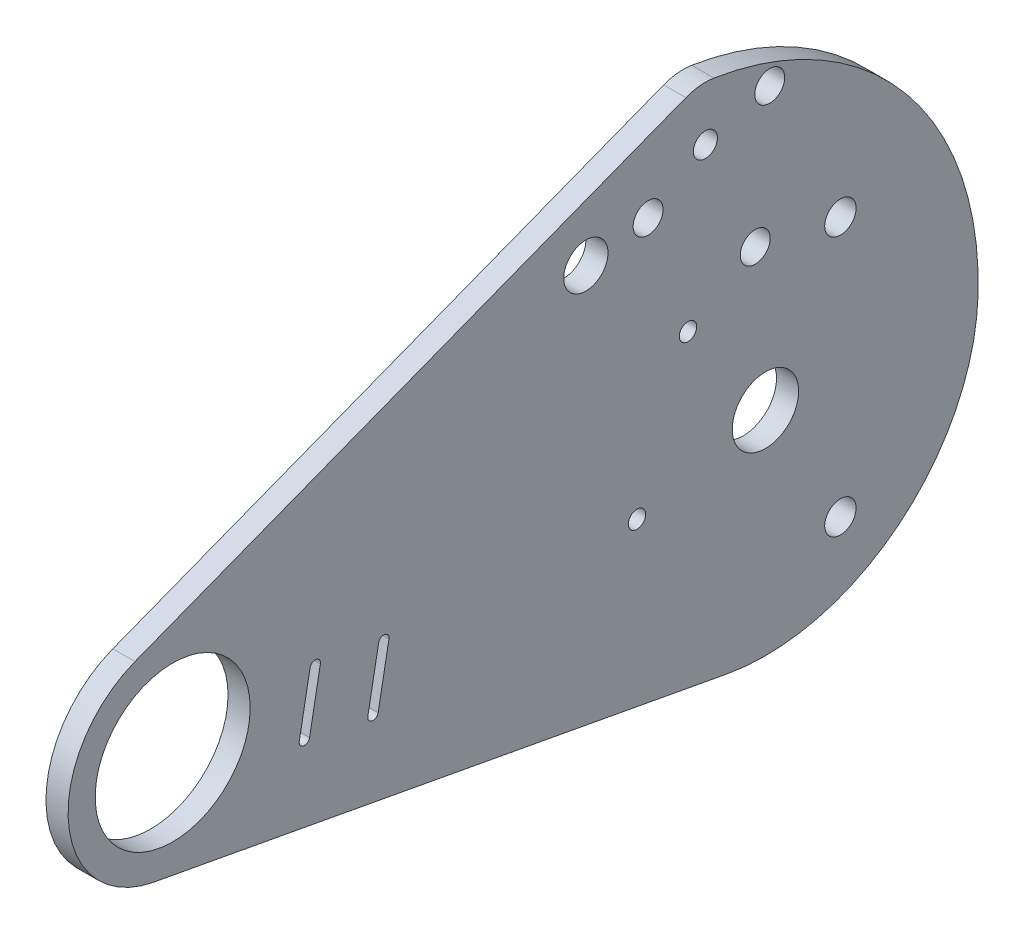
ISO-10303-21;
HEADER;
FILE_DESCRIPTION(('STEP AP214'),'2;1');
FILE_NAME('part.step','',(''),(''),'','','');
FILE_SCHEMA(('AUTOMOTIVE_DESIGN { 1 0 10303 214 1 1 1 1 }'));
ENDSEC;
DATA;
#1=APPLICATION_CONTEXT('core data for automotive mechanical design processes');
#2=APPLICATION_PROTOCOL_DEFINITION('international standard','automotive_design',2000,#1);
#3=PRODUCT_CONTEXT('',#1,'mechanical');
#4=PRODUCT('Part','Part','',(#3));
#5=PRODUCT_RELATED_PRODUCT_CATEGORY('part','',(#4));
#6=PRODUCT_DEFINITION_FORMATION('','',#4);
#7=PRODUCT_DEFINITION_CONTEXT('part definition',#1,'design');
#8=PRODUCT_DEFINITION('design','',#6,#7);
#9=PRODUCT_DEFINITION_SHAPE('','',#8);
#10=(LENGTH_UNIT() NAMED_UNIT(*) SI_UNIT(.MILLI.,.METRE.));
#11=(NAMED_UNIT(*) PLANE_ANGLE_UNIT() SI_UNIT($,.RADIAN.));
#12=(NAMED_UNIT(*) SI_UNIT($,.STERADIAN.) SOLID_ANGLE_UNIT());
#13=UNCERTAINTY_MEASURE_WITH_UNIT(LENGTH_MEASURE(1.E-05),#10,'distance_accuracy_value','');
#14=(GEOMETRIC_REPRESENTATION_CONTEXT(3) GLOBAL_UNCERTAINTY_ASSIGNED_CONTEXT((#13)) GLOBAL_UNIT_ASSIGNED_CONTEXT((#10,
#11,#12)) REPRESENTATION_CONTEXT('',''));
#15=CARTESIAN_POINT('',(0.,0.,0.));
#16=DIRECTION('',(0.,0.,1.));
#17=DIRECTION('',(1.,0.,0.));
#18=AXIS2_PLACEMENT_3D('',#15,#16,#17);
#19=CARTESIAN_POINT('',(1.5875,0.,0.));
#20=DIRECTION('',(1.,0.,0.));
#21=DIRECTION('',(0.,0.,-1.));
#22=AXIS2_PLACEMENT_3D('',#19,#20,#21);
#23=PLANE('',#22);
#24=CARTESIAN_POINT('',(1.5875,39.9652074165991,-85.6143066743534));
#25=DIRECTION('',(1.,0.,0.));
#26=DIRECTION('',(0.,0.,-1.));
#27=AXIS2_PLACEMENT_3D('',#24,#25,#26);
#28=CIRCLE('',#27,2.15);
#29=CARTESIAN_POINT('',(1.5875,39.9652074165991,-87.7643066743534));
#30=VERTEX_POINT('',#29);
#31=EDGE_CURVE('E541',#30,#30,#28,.T.);
#32=ORIENTED_EDGE('',*,*,#31,.F.);
#33=EDGE_LOOP('',(#32));
#34=FACE_BOUND('',#33,.T.);
#35=CARTESIAN_POINT('',(1.5875,21.0263746539928,-83.5356981036909));
#36=DIRECTION('',(1.,0.,0.));
#37=DIRECTION('',(0.,0.,-1.));
#38=AXIS2_PLACEMENT_3D('',#35,#36,#37);
#39=CIRCLE('',#38,2.15);
#40=CARTESIAN_POINT('',(1.5875,21.0263746539928,-85.6856981036909));
#41=VERTEX_POINT('',#40);
#42=EDGE_CURVE('E533',#41,#41,#39,.T.);
#43=ORIENTED_EDGE('',*,*,#42,.F.);
#44=EDGE_LOOP('',(#43));
#45=FACE_BOUND('',#44,.T.);
#46=CARTESIAN_POINT('',(1.5875,32.2959188620137,-68.1734920985801));
#47=DIRECTION('',(1.,0.,0.));
#48=DIRECTION('',(0.,0.,-1.));
#49=AXIS2_PLACEMENT_3D('',#46,#47,#48);
#50=CIRCLE('',#49,2.15);
#51=CARTESIAN_POINT('',(1.5875,32.2959188620137,-70.3234920985801));
#52=VERTEX_POINT('',#51);
#53=EDGE_CURVE('E523',#52,#52,#50,.T.);
#54=ORIENTED_EDGE('',*,*,#53,.F.);
#55=EDGE_LOOP('',(#54));
#56=FACE_BOUND('',#55,.T.);
#57=CARTESIAN_POINT('',(1.5875,30.8448073641004,-59.2523236563052));
#58=DIRECTION('',(1.,0.,0.));
#59=DIRECTION('',(0.,0.,-1.));
#60=AXIS2_PLACEMENT_3D('',#57,#58,#59);
#61=CIRCLE('',#60,3.17499999999999);
#62=CARTESIAN_POINT('',(1.5875,30.8448073641004,-62.4273236563052));
#63=VERTEX_POINT('',#62);
#64=EDGE_CURVE('E363',#63,#63,#61,.T.);
#65=ORIENTED_EDGE('',*,*,#64,.F.);
#66=EDGE_LOOP('',(#65));
#67=FACE_BOUND('',#66,.T.);
#68=CARTESIAN_POINT('',(1.5875,37.2807523985732,-76.3881240808824));
#69=DIRECTION('',(1.,0.,0.));
#70=DIRECTION('',(0.,0.,-1.));
#71=AXIS2_PLACEMENT_3D('',#68,#69,#70);
#72=CIRCLE('',#71,1.72719999999999);
#73=CARTESIAN_POINT('',(1.5875,37.2807523985732,-78.1153240808824));
#74=VERTEX_POINT('',#73);
#75=EDGE_CURVE('E371',#74,#74,#72,.T.);
#76=ORIENTED_EDGE('',*,*,#75,.F.);
#77=EDGE_LOOP('',(#76));
#78=FACE_BOUND('',#77,.T.);
#79=CARTESIAN_POINT('',(1.5875,18.6195461813655,-95.7499999999999));
#80=DIRECTION('',(1.,0.,0.));
#81=DIRECTION('',(0.,0.,-1.));
#82=AXIS2_PLACEMENT_3D('',#79,#80,#81);
#83=CIRCLE('',#82,2.24999999999999);
#84=CARTESIAN_POINT('',(1.5875,18.6195461813655,-97.9999999999999));
#85=VERTEX_POINT('',#84);
#86=EDGE_CURVE('E379',#85,#85,#83,.T.);
#87=ORIENTED_EDGE('',*,*,#86,.F.);
#88=EDGE_LOOP('',(#87));
#89=FACE_BOUND('',#88,.T.);
#90=CARTESIAN_POINT('',(1.5875,-18.6195461813654,-95.7500000000001));
#91=DIRECTION('',(1.,0.,0.));
#92=DIRECTION('',(0.,0.,-1.));
#93=AXIS2_PLACEMENT_3D('',#90,#91,#92);
#94=CIRCLE('',#93,2.24999999999999);
#95=CARTESIAN_POINT('',(1.5875,-18.6195461813654,-98.0000000000001));
#96=VERTEX_POINT('',#95);
#97=EDGE_CURVE('E387',#96,#96,#94,.T.);
#98=ORIENTED_EDGE('',*,*,#97,.F.);
#99=EDGE_LOOP('',(#98));
#100=FACE_BOUND('',#99,.T.);
#101=CARTESIAN_POINT('',(1.5875,15.3168243350308,-73.8964963957403));
#102=DIRECTION('',(1.,0.,0.));
#103=DIRECTION('',(0.,0.,-1.));
#104=AXIS2_PLACEMENT_3D('',#101,#102,#103);
#105=CIRCLE('',#104,1.25);
#106=CARTESIAN_POINT('',(1.5875,15.3168243350308,-75.1464963957403));
#107=VERTEX_POINT('',#106);
#108=EDGE_CURVE('E395',#107,#107,#105,.T.);
#109=ORIENTED_EDGE('',*,*,#108,.F.);
#110=EDGE_LOOP('',(#109));
#111=FACE_BOUND('',#110,.T.);
#112=CARTESIAN_POINT('',(1.5875,-4.3259081604463,-66.5831756649692));
#113=DIRECTION('',(1.,0.,0.));
#114=DIRECTION('',(0.,0.,-1.));
#115=AXIS2_PLACEMENT_3D('',#112,#113,#114);
#116=CIRCLE('',#115,1.25);
#117=CARTESIAN_POINT('',(1.5875,-4.3259081604463,-67.8331756649692));
#118=VERTEX_POINT('',#117);
#119=EDGE_CURVE('E403',#118,#118,#116,.T.);
#120=ORIENTED_EDGE('',*,*,#119,.F.);
#121=EDGE_LOOP('',(#120));
#122=FACE_BOUND('',#121,.T.);
#123=CARTESIAN_POINT('',(1.5875,37.2807523985732,-76.3881240808824));
#124=DIRECTION('',(1.,0.,0.));
#125=DIRECTION('',(0.,0.,-1.));
#126=AXIS2_PLACEMENT_3D('',#123,#124,#125);
#127=CIRCLE('',#126,7.76249999999999);
#128=CARTESIAN_POINT('',(1.5875,44.9458946399291,-77.6136854501257));
#129=VERTEX_POINT('',#128);
#130=CARTESIAN_POINT('',(1.5875,44.5213438158952,-73.5898670917189));
#131=VERTEX_POINT('',#130);
#132=EDGE_CURVE('E412',#129,#131,#127,.T.);
#133=ORIENTED_EDGE('',*,*,#132,.T.);
#134=DIRECTION('',(0.,-0.360483992162769,0.932765399977075));
#135=VECTOR('',#134,1.);
#136=CARTESIAN_POINT('',(1.5875,13.9914809996561,5.40725988244154));
#137=LINE('',#136,#135);
#138=CARTESIAN_POINT('',(1.5875,13.9914809996561,5.40725988244153));
#139=VERTEX_POINT('',#138);
#140=EDGE_CURVE('E416',#131,#139,#137,.T.);
#141=ORIENTED_EDGE('',*,*,#140,.T.);
#142=CARTESIAN_POINT('',(1.5875,0.,0.));
#143=DIRECTION('',(1.,0.,0.));
#144=DIRECTION('',(0.,0.,-1.));
#145=AXIS2_PLACEMENT_3D('',#142,#143,#144);
#146=CIRCLE('',#145,15.);
#147=CARTESIAN_POINT('',(1.5875,-14.7484970790235,2.73529411764706));
#148=VERTEX_POINT('',#147);
#149=EDGE_CURVE('E420',#139,#148,#146,.T.);
#150=ORIENTED_EDGE('',*,*,#149,.T.);
#151=DIRECTION('',(0.,-0.182352941176471,-0.983233138601568));
#152=VECTOR('',#151,1.);
#153=CARTESIAN_POINT('',(1.5875,-14.7484970790235,2.73529411764706));
#154=LINE('',#153,#152);
#155=CARTESIAN_POINT('',(1.5875,-29.9886107273478,-79.4382352941177));
#156=VERTEX_POINT('',#155);
#157=EDGE_CURVE('E423',#148,#156,#154,.T.);
#158=ORIENTED_EDGE('',*,*,#157,.T.);
#159=CARTESIAN_POINT('',(1.5875,0.,-85.));
#160=DIRECTION('',(1.,0.,0.));
#161=DIRECTION('',(0.,0.,-1.));
#162=AXIS2_PLACEMENT_3D('',#159,#160,#161);
#163=CIRCLE('',#162,30.5);
#164=CARTESIAN_POINT('',(1.5875,-1.07336324356705,-115.481107121418));
#165=VERTEX_POINT('',#164);
#166=EDGE_CURVE('E426',#156,#165,#163,.T.);
#167=ORIENTED_EDGE('',*,*,#166,.T.);
#168=CARTESIAN_POINT('',(1.5875,0.510287443663022,-70.5089818603095));
#169=DIRECTION('',(1.,0.,0.));
#170=DIRECTION('',(0.,0.,-1.));
#171=AXIS2_PLACEMENT_3D('',#168,#169,#170);
#172=CIRCLE('',#171,45.);
#173=EDGE_CURVE('E429',#129,#165,#172,.F.);
#174=ORIENTED_EDGE('',*,*,#173,.F.);
#175=EDGE_LOOP('',(#133,#141,#150,#158,#167,#174));
#176=FACE_BOUND('',#175,.T.);
#177=CARTESIAN_POINT('',(1.5875,0.,-85.));
#178=DIRECTION('',(1.,0.,0.));
#179=DIRECTION('',(0.,0.,-1.));
#180=AXIS2_PLACEMENT_3D('',#177,#178,#179);
#181=CIRCLE('',#180,4.7625);
#182=CARTESIAN_POINT('',(1.5875,0.,-89.7625));
#183=VERTEX_POINT('',#182);
#184=EDGE_CURVE('E433',#183,#183,#181,.T.);
#185=ORIENTED_EDGE('',*,*,#184,.F.);
#186=EDGE_LOOP('',(#185));
#187=FACE_BOUND('',#186,.T.);
#188=CARTESIAN_POINT('',(1.5875,0.,0.));
#189=DIRECTION('',(1.,0.,0.));
#190=DIRECTION('',(0.,0.,-1.));
#191=AXIS2_PLACEMENT_3D('',#188,#189,#190);
#192=CIRCLE('',#191,11.1125);
#193=CARTESIAN_POINT('',(1.5875,0.,-11.1125));
#194=VERTEX_POINT('',#193);
#195=EDGE_CURVE('E437',#194,#194,#192,.T.);
#196=ORIENTED_EDGE('',*,*,#195,.F.);
#197=EDGE_LOOP('',(#196));
#198=FACE_BOUND('',#197,.T.);
#199=CARTESIAN_POINT('',(1.5875,-1.29184739623745,-30.271994158047));
#200=DIRECTION('',(1.,0.,0.));
#201=DIRECTION('',(0.,0.,-1.));
#202=AXIS2_PLACEMENT_3D('',#199,#200,#201);
#203=CIRCLE('',#202,0.749999999999987);
#204=CARTESIAN_POINT('',(1.5875,-1.4286121021198,-31.0094190119982));
#205=VERTEX_POINT('',#204);
#206=CARTESIAN_POINT('',(1.5875,-1.1550826903551,-29.5345693040959));
#207=VERTEX_POINT('',#206);
#208=EDGE_CURVE('E341',#205,#207,#203,.T.);
#209=ORIENTED_EDGE('',*,*,#208,.F.);
#210=DIRECTION('',(0.,-0.983233138601568,0.182352941176471));
#211=VECTOR('',#210,1.);
#212=CARTESIAN_POINT('',(1.5875,-1.4286121021198,-31.0094190119982));
#213=LINE('',#212,#211);
#214=CARTESIAN_POINT('',(1.5875,-9.78609378023314,-29.4594190119982));
#215=VERTEX_POINT('',#214);
#216=EDGE_CURVE('E337',#205,#215,#213,.T.);
#217=ORIENTED_EDGE('',*,*,#216,.T.);
#218=CARTESIAN_POINT('',(1.5875,-9.64932907435079,-28.721994158047));
#219=DIRECTION('',(1.,0.,0.));
#220=DIRECTION('',(0.,0.,-1.));
#221=AXIS2_PLACEMENT_3D('',#218,#219,#220);
#222=CIRCLE('',#221,0.749999999999987);
#223=CARTESIAN_POINT('',(1.5875,-9.51256436846843,-27.9845693040958));
#224=VERTEX_POINT('',#223);
#225=EDGE_CURVE('E352',#224,#215,#222,.T.);
#226=ORIENTED_EDGE('',*,*,#225,.F.);
#227=DIRECTION('',(0.,-0.983233138601568,0.182352941176471));
#228=VECTOR('',#227,1.);
#229=CARTESIAN_POINT('',(1.5875,-1.15508269035509,-29.5345693040958));
#230=LINE('',#229,#228);
#231=EDGE_CURVE('E333',#207,#224,#230,.T.);
#232=ORIENTED_EDGE('',*,*,#231,.F.);
#233=EDGE_LOOP('',(#209,#217,#226,#232));
#234=FACE_BOUND('',#233,.T.);
#235=CARTESIAN_POINT('',(1.5875,0.531682015527253,-20.4396627720314));
#236=DIRECTION('',(1.,0.,0.));
#237=DIRECTION('',(0.,0.,-1.));
#238=AXIS2_PLACEMENT_3D('',#235,#236,#237);
#239=CIRCLE('',#238,0.749999999999987);
#240=CARTESIAN_POINT('',(1.5875,0.394917309644902,-21.1770876259825));
#241=VERTEX_POINT('',#240);
#242=CARTESIAN_POINT('',(1.5875,0.668446721409603,-19.7022379180802));
#243=VERTEX_POINT('',#242);
#244=EDGE_CURVE('E311',#241,#243,#239,.T.);
#245=ORIENTED_EDGE('',*,*,#244,.F.);
#246=DIRECTION('',(0.,-0.983233138601568,0.182352941176471));
#247=VECTOR('',#246,1.);
#248=CARTESIAN_POINT('',(1.5875,0.394917309644902,-21.1770876259825));
#249=LINE('',#248,#247);
#250=CARTESIAN_POINT('',(1.5875,-7.96256436846843,-19.6270876259825));
#251=VERTEX_POINT('',#250);
#252=EDGE_CURVE('E301',#241,#251,#249,.T.);
#253=ORIENTED_EDGE('',*,*,#252,.T.);
#254=CARTESIAN_POINT('',(1.5875,-7.82579966258608,-18.8896627720314));
#255=DIRECTION('',(1.,0.,0.));
#256=DIRECTION('',(0.,0.,-1.));
#257=AXIS2_PLACEMENT_3D('',#254,#255,#256);
#258=CIRCLE('',#257,0.749999999999987);
#259=CARTESIAN_POINT('',(1.5875,-7.68903495670373,-18.1522379180802));
#260=VERTEX_POINT('',#259);
#261=EDGE_CURVE('E319',#260,#251,#258,.T.);
#262=ORIENTED_EDGE('',*,*,#261,.F.);
#263=DIRECTION('',(0.,-0.983233138601568,0.182352941176471));
#264=VECTOR('',#263,1.);
#265=CARTESIAN_POINT('',(1.5875,0.668446721409605,-19.7022379180802));
#266=LINE('',#265,#264);
#267=EDGE_CURVE('E312',#243,#260,#266,.T.);
#268=ORIENTED_EDGE('',*,*,#267,.F.);
#269=EDGE_LOOP('',(#245,#253,#262,#268));
#270=FACE_BOUND('',#269,.T.);
#271=ADVANCED_FACE('F197',(#34,#45,#56,#67,#78,#89,#100,#111,#122,#176,#187,#198,#234,#270),#23,.T.);
#272=CARTESIAN_POINT('',(1.5875,37.2807523985732,-76.3881240808824));
#273=DIRECTION('',(-1.,0.,0.));
#274=DIRECTION('',(0.,0.,1.));
#275=AXIS2_PLACEMENT_3D('',#272,#273,#274);
#276=CYLINDRICAL_SURFACE('',#275,7.76249999999999);
#277=CARTESIAN_POINT('',(-1.5875,37.2807523985732,-76.3881240808824));
#278=DIRECTION('',(1.,0.,0.));
#279=DIRECTION('',(0.,0.,-1.));
#280=AXIS2_PLACEMENT_3D('',#277,#278,#279);
#281=CIRCLE('',#280,7.76249999999999);
#282=CARTESIAN_POINT('',(-1.5875,44.9458946399291,-77.6136854501257));
#283=VERTEX_POINT('',#282);
#284=CARTESIAN_POINT('',(-1.5875,44.5213438158952,-73.5898670917189));
#285=VERTEX_POINT('',#284);
#286=EDGE_CURVE('E411',#283,#285,#281,.T.);
#287=ORIENTED_EDGE('',*,*,#286,.T.);
#288=DIRECTION('',(-1.,0.,0.));
#289=VECTOR('',#288,1.);
#290=CARTESIAN_POINT('',(1.5875,44.5213438158952,-73.5898670917189));
#291=LINE('',#290,#289);
#292=EDGE_CURVE('E486',#131,#285,#291,.T.);
#293=ORIENTED_EDGE('',*,*,#292,.F.);
#294=ORIENTED_EDGE('',*,*,#132,.F.);
#295=DIRECTION('',(-1.,0.,0.));
#296=VECTOR('',#295,1.);
#297=CARTESIAN_POINT('',(1.5875,44.9458946399291,-77.6136854501257));
#298=LINE('',#297,#296);
#299=EDGE_CURVE('E441',#129,#283,#298,.T.);
#300=ORIENTED_EDGE('',*,*,#299,.T.);
#301=EDGE_LOOP('',(#287,#293,#294,#300));
#302=FACE_BOUND('',#301,.T.);
#303=ADVANCED_FACE('F199',(#302),#276,.T.);
#304=CARTESIAN_POINT('',(1.5875,13.9914809996561,5.40725988244154));
#305=DIRECTION('',(0.,-0.932765399977075,-0.360483992162769));
#306=DIRECTION('',(0.,0.360483992162769,-0.932765399977075));
#307=AXIS2_PLACEMENT_3D('',#304,#305,#306);
#308=PLANE('',#307);
#309=DIRECTION('',(0.,-0.360483992162769,0.932765399977075));
#310=VECTOR('',#309,1.);
#311=CARTESIAN_POINT('',(-1.5875,13.9914809996561,5.40725988244154));
#312=LINE('',#311,#310);
#313=CARTESIAN_POINT('',(-1.5875,13.9914809996561,5.40725988244153));
#314=VERTEX_POINT('',#313);
#315=EDGE_CURVE('E445',#285,#314,#312,.T.);
#316=ORIENTED_EDGE('',*,*,#315,.T.);
#317=DIRECTION('',(-1.,0.,0.));
#318=VECTOR('',#317,1.);
#319=CARTESIAN_POINT('',(1.5875,13.9914809996561,5.40725988244153));
#320=LINE('',#319,#318);
#321=EDGE_CURVE('E482',#139,#314,#320,.T.);
#322=ORIENTED_EDGE('',*,*,#321,.F.);
#323=ORIENTED_EDGE('',*,*,#140,.F.);
#324=ORIENTED_EDGE('',*,*,#292,.T.);
#325=EDGE_LOOP('',(#316,#322,#323,#324));
#326=FACE_BOUND('',#325,.T.);
#327=ADVANCED_FACE('F653',(#326),#308,.F.);
#328=CARTESIAN_POINT('',(1.5875,0.,0.));
#329=DIRECTION('',(-1.,0.,0.));
#330=DIRECTION('',(0.,0.,1.));
#331=AXIS2_PLACEMENT_3D('',#328,#329,#330);
#332=CYLINDRICAL_SURFACE('',#331,15.);
#333=CARTESIAN_POINT('',(-1.5875,0.,0.));
#334=DIRECTION('',(1.,0.,0.));
#335=DIRECTION('',(0.,0.,-1.));
#336=AXIS2_PLACEMENT_3D('',#333,#334,#335);
#337=CIRCLE('',#336,15.);
#338=CARTESIAN_POINT('',(-1.5875,-14.7484970790235,2.73529411764706));
#339=VERTEX_POINT('',#338);
#340=EDGE_CURVE('E448',#314,#339,#337,.T.);
#341=ORIENTED_EDGE('',*,*,#340,.T.);
#342=DIRECTION('',(-1.,0.,0.));
#343=VECTOR('',#342,1.);
#344=CARTESIAN_POINT('',(1.5875,-14.7484970790235,2.73529411764706));
#345=LINE('',#344,#343);
#346=EDGE_CURVE('E478',#148,#339,#345,.T.);
#347=ORIENTED_EDGE('',*,*,#346,.F.);
#348=ORIENTED_EDGE('',*,*,#149,.F.);
#349=ORIENTED_EDGE('',*,*,#321,.T.);
#350=EDGE_LOOP('',(#341,#347,#348,#349));
#351=FACE_BOUND('',#350,.T.);
#352=ADVANCED_FACE('F650',(#351),#332,.T.);
#353=CARTESIAN_POINT('',(1.5875,-14.7484970790235,2.73529411764706));
#354=DIRECTION('',(0.,0.983233138601568,-0.182352941176471));
#355=DIRECTION('',(0.,0.182352941176471,0.983233138601568));
#356=AXIS2_PLACEMENT_3D('',#353,#354,#355);
#357=PLANE('',#356);
#358=DIRECTION('',(0.,-0.182352941176471,-0.983233138601568));
#359=VECTOR('',#358,1.);
#360=CARTESIAN_POINT('',(-1.5875,-14.7484970790235,2.73529411764706));
#361=LINE('',#360,#359);
#362=CARTESIAN_POINT('',(-1.5875,-29.9886107273478,-79.4382352941177));
#363=VERTEX_POINT('',#362);
#364=EDGE_CURVE('E451',#339,#363,#361,.T.);
#365=ORIENTED_EDGE('',*,*,#364,.T.);
#366=DIRECTION('',(-1.,0.,0.));
#367=VECTOR('',#366,1.);
#368=CARTESIAN_POINT('',(1.5875,-29.9886107273478,-79.4382352941177));
#369=LINE('',#368,#367);
#370=EDGE_CURVE('E474',#156,#363,#369,.T.);
#371=ORIENTED_EDGE('',*,*,#370,.F.);
#372=ORIENTED_EDGE('',*,*,#157,.F.);
#373=ORIENTED_EDGE('',*,*,#346,.T.);
#374=EDGE_LOOP('',(#365,#371,#372,#373));
#375=FACE_BOUND('',#374,.T.);
#376=ADVANCED_FACE('F646',(#375),#357,.F.);
#377=CARTESIAN_POINT('',(1.5875,0.,-85.));
#378=DIRECTION('',(-1.,0.,0.));
#379=DIRECTION('',(0.,0.,1.));
#380=AXIS2_PLACEMENT_3D('',#377,#378,#379);
#381=CYLINDRICAL_SURFACE('',#380,30.5);
#382=CARTESIAN_POINT('',(-1.5875,0.,-85.));
#383=DIRECTION('',(1.,0.,0.));
#384=DIRECTION('',(0.,0.,-1.));
#385=AXIS2_PLACEMENT_3D('',#382,#383,#384);
#386=CIRCLE('',#385,30.5);
#387=CARTESIAN_POINT('',(-1.5875,-1.07336324356705,-115.481107121418));
#388=VERTEX_POINT('',#387);
#389=EDGE_CURVE('E454',#363,#388,#386,.T.);
#390=ORIENTED_EDGE('',*,*,#389,.T.);
#391=DIRECTION('',(-1.,0.,0.));
#392=VECTOR('',#391,1.);
#393=CARTESIAN_POINT('',(1.5875,-1.07336324356705,-115.481107121418));
#394=LINE('',#393,#392);
#395=EDGE_CURVE('E471',#165,#388,#394,.T.);
#396=ORIENTED_EDGE('',*,*,#395,.F.);
#397=ORIENTED_EDGE('',*,*,#166,.F.);
#398=ORIENTED_EDGE('',*,*,#370,.T.);
#399=EDGE_LOOP('',(#390,#396,#397,#398));
#400=FACE_BOUND('',#399,.T.);
#401=ADVANCED_FACE('F639',(#400),#381,.T.);
#402=CARTESIAN_POINT('',(1.5875,0.,-85.));
#403=DIRECTION('',(-1.,0.,0.));
#404=DIRECTION('',(0.,0.,1.));
#405=AXIS2_PLACEMENT_3D('',#402,#403,#404);
#406=CYLINDRICAL_SURFACE('',#405,4.7625);
#407=ORIENTED_EDGE('',*,*,#184,.T.);
#408=EDGE_LOOP('',(#407));
#409=FACE_BOUND('',#408,.T.);
#410=CARTESIAN_POINT('',(-1.5875,0.,-85.));
#411=DIRECTION('',(1.,0.,0.));
#412=DIRECTION('',(0.,0.,-1.));
#413=AXIS2_PLACEMENT_3D('',#410,#411,#412);
#414=CIRCLE('',#413,4.7625);
#415=CARTESIAN_POINT('',(-1.5875,0.,-89.7625));
#416=VERTEX_POINT('',#415);
#417=EDGE_CURVE('E462',#416,#416,#414,.T.);
#418=ORIENTED_EDGE('',*,*,#417,.F.);
#419=EDGE_LOOP('',(#418));
#420=FACE_BOUND('',#419,.T.);
#421=ADVANCED_FACE('F636',(#409,#420),#406,.F.);
#422=CARTESIAN_POINT('',(1.5875,0.510287443663022,-70.5089818603095));
#423=DIRECTION('',(-1.,0.,0.));
#424=DIRECTION('',(0.,0.,1.));
#425=AXIS2_PLACEMENT_3D('',#422,#423,#424);
#426=CYLINDRICAL_SURFACE('',#425,45.);
#427=CARTESIAN_POINT('',(-1.5875,0.510287443663022,-70.5089818603095));
#428=DIRECTION('',(1.,0.,0.));
#429=DIRECTION('',(0.,0.,-1.));
#430=AXIS2_PLACEMENT_3D('',#427,#428,#429);
#431=CIRCLE('',#430,45.);
#432=EDGE_CURVE('E458',#283,#388,#431,.F.);
#433=ORIENTED_EDGE('',*,*,#432,.F.);
#434=ORIENTED_EDGE('',*,*,#299,.F.);
#435=ORIENTED_EDGE('',*,*,#173,.T.);
#436=ORIENTED_EDGE('',*,*,#395,.T.);
#437=EDGE_LOOP('',(#433,#434,#435,#436));
#438=FACE_BOUND('',#437,.T.);
#439=ADVANCED_FACE('F634',(#438),#426,.T.);
#440=CARTESIAN_POINT('',(1.5875,0.,0.));
#441=DIRECTION('',(-1.,0.,0.));
#442=DIRECTION('',(0.,0.,1.));
#443=AXIS2_PLACEMENT_3D('',#440,#441,#442);
#444=CYLINDRICAL_SURFACE('',#443,11.1125);
#445=ORIENTED_EDGE('',*,*,#195,.T.);
#446=EDGE_LOOP('',(#445));
#447=FACE_BOUND('',#446,.T.);
#448=CARTESIAN_POINT('',(-1.5875,0.,0.));
#449=DIRECTION('',(1.,0.,0.));
#450=DIRECTION('',(0.,0.,-1.));
#451=AXIS2_PLACEMENT_3D('',#448,#449,#450);
#452=CIRCLE('',#451,11.1125);
#453=CARTESIAN_POINT('',(-1.5875,0.,-11.1125));
#454=VERTEX_POINT('',#453);
#455=EDGE_CURVE('E417',#454,#454,#452,.T.);
#456=ORIENTED_EDGE('',*,*,#455,.F.);
#457=EDGE_LOOP('',(#456));
#458=FACE_BOUND('',#457,.T.);
#459=ADVANCED_FACE('F630',(#447,#458),#444,.F.);
#460=CARTESIAN_POINT('',(-1.5875,0.,0.));
#461=DIRECTION('',(1.,0.,0.));
#462=DIRECTION('',(0.,0.,-1.));
#463=AXIS2_PLACEMENT_3D('',#460,#461,#462);
#464=PLANE('',#463);
#465=CARTESIAN_POINT('',(-1.5875,39.9652074165991,-85.6143066743534));
#466=DIRECTION('',(1.,0.,0.));
#467=DIRECTION('',(0.,0.,-1.));
#468=AXIS2_PLACEMENT_3D('',#465,#466,#467);
#469=CIRCLE('',#468,2.15);
#470=CARTESIAN_POINT('',(-1.5875,39.9652074165991,-87.7643066743534));
#471=VERTEX_POINT('',#470);
#472=EDGE_CURVE('E537',#471,#471,#469,.T.);
#473=ORIENTED_EDGE('',*,*,#472,.T.);
#474=EDGE_LOOP('',(#473));
#475=FACE_BOUND('',#474,.T.);
#476=CARTESIAN_POINT('',(-1.5875,21.0263746539928,-83.5356981036909));
#477=DIRECTION('',(1.,0.,0.));
#478=DIRECTION('',(0.,0.,-1.));
#479=AXIS2_PLACEMENT_3D('',#476,#477,#478);
#480=CIRCLE('',#479,2.15);
#481=CARTESIAN_POINT('',(-1.5875,21.0263746539928,-85.6856981036909));
#482=VERTEX_POINT('',#481);
#483=EDGE_CURVE('E529',#482,#482,#480,.T.);
#484=ORIENTED_EDGE('',*,*,#483,.T.);
#485=EDGE_LOOP('',(#484));
#486=FACE_BOUND('',#485,.T.);
#487=CARTESIAN_POINT('',(-1.5875,32.2959188620137,-68.1734920985801));
#488=DIRECTION('',(1.,0.,0.));
#489=DIRECTION('',(0.,0.,-1.));
#490=AXIS2_PLACEMENT_3D('',#487,#488,#489);
#491=CIRCLE('',#490,2.15);
#492=CARTESIAN_POINT('',(-1.5875,32.2959188620137,-70.3234920985801));
#493=VERTEX_POINT('',#492);
#494=EDGE_CURVE('E520',#493,#493,#491,.T.);
#495=ORIENTED_EDGE('',*,*,#494,.T.);
#496=EDGE_LOOP('',(#495));
#497=FACE_BOUND('',#496,.T.);
#498=CARTESIAN_POINT('',(-1.5875,-7.82579966258608,-18.8896627720314));
#499=DIRECTION('',(1.,0.,0.));
#500=DIRECTION('',(0.,0.,-1.));
#501=AXIS2_PLACEMENT_3D('',#498,#499,#500);
#502=CIRCLE('',#501,0.749999999999993);
#503=CARTESIAN_POINT('',(-1.5875,-7.68903495670374,-18.1522379180802));
#504=VERTEX_POINT('',#503);
#505=CARTESIAN_POINT('',(-1.5875,-7.96256436846844,-19.6270876259825));
#506=VERTEX_POINT('',#505);
#507=EDGE_CURVE('E206',#504,#506,#502,.T.);
#508=ORIENTED_EDGE('',*,*,#507,.T.);
#509=DIRECTION('',(0.,0.983233138601568,-0.182352941176471));
#510=VECTOR('',#509,1.);
#511=CARTESIAN_POINT('',(-1.5875,-3.78382352941177,-20.4020876259825));
#512=LINE('',#511,#510);
#513=CARTESIAN_POINT('',(-1.5875,0.394917309644908,-21.1770876259825));
#514=VERTEX_POINT('',#513);
#515=EDGE_CURVE('E13',#506,#514,#512,.T.);
#516=ORIENTED_EDGE('',*,*,#515,.T.);
#517=CARTESIAN_POINT('',(-1.5875,0.531682015527253,-20.4396627720314));
#518=DIRECTION('',(1.,0.,0.));
#519=DIRECTION('',(0.,0.,-1.));
#520=AXIS2_PLACEMENT_3D('',#517,#518,#519);
#521=CIRCLE('',#520,0.749999999999993);
#522=CARTESIAN_POINT('',(-1.5875,0.668446721409606,-19.7022379180802));
#523=VERTEX_POINT('',#522);
#524=EDGE_CURVE('E317',#514,#523,#521,.T.);
#525=ORIENTED_EDGE('',*,*,#524,.T.);
#526=DIRECTION('',(0.,-0.983233138601568,0.182352941176471));
#527=VECTOR('',#526,1.);
#528=CARTESIAN_POINT('',(-1.5875,-3.51029411764707,-18.9272379180802));
#529=LINE('',#528,#527);
#530=EDGE_CURVE('E506',#523,#504,#529,.T.);
#531=ORIENTED_EDGE('',*,*,#530,.T.);
#532=EDGE_LOOP('',(#508,#516,#525,#531));
#533=FACE_BOUND('',#532,.T.);
#534=CARTESIAN_POINT('',(-1.5875,-9.64932907435079,-28.721994158047));
#535=DIRECTION('',(1.,0.,0.));
#536=DIRECTION('',(0.,0.,-1.));
#537=AXIS2_PLACEMENT_3D('',#534,#535,#536);
#538=CIRCLE('',#537,0.749999999999993);
#539=CARTESIAN_POINT('',(-1.5875,-9.51256436846844,-27.9845693040959));
#540=VERTEX_POINT('',#539);
#541=CARTESIAN_POINT('',(-1.5875,-9.78609378023315,-29.4594190119982));
#542=VERTEX_POINT('',#541);
#543=EDGE_CURVE('E498',#540,#542,#538,.T.);
#544=ORIENTED_EDGE('',*,*,#543,.T.);
#545=DIRECTION('',(0.,0.983233138601568,-0.182352941176471));
#546=VECTOR('',#545,1.);
#547=CARTESIAN_POINT('',(-1.5875,-5.60735294117648,-30.2344190119982));
#548=LINE('',#547,#546);
#549=CARTESIAN_POINT('',(-1.5875,-1.4286121021198,-31.0094190119982));
#550=VERTEX_POINT('',#549);
#551=EDGE_CURVE('E502',#542,#550,#548,.T.);
#552=ORIENTED_EDGE('',*,*,#551,.T.);
#553=CARTESIAN_POINT('',(-1.5875,-1.29184739623745,-30.271994158047));
#554=DIRECTION('',(1.,0.,0.));
#555=DIRECTION('',(0.,0.,-1.));
#556=AXIS2_PLACEMENT_3D('',#553,#554,#555);
#557=CIRCLE('',#556,0.749999999999993);
#558=CARTESIAN_POINT('',(-1.5875,-1.15508269035509,-29.5345693040959));
#559=VERTEX_POINT('',#558);
#560=EDGE_CURVE('E494',#550,#559,#557,.T.);
#561=ORIENTED_EDGE('',*,*,#560,.T.);
#562=DIRECTION('',(0.,-0.983233138601568,0.182352941176471));
#563=VECTOR('',#562,1.);
#564=CARTESIAN_POINT('',(-1.5875,-5.33382352941177,-28.7595693040959));
#565=LINE('',#564,#563);
#566=EDGE_CURVE('E490',#559,#540,#565,.T.);
#567=ORIENTED_EDGE('',*,*,#566,.T.);
#568=EDGE_LOOP('',(#544,#552,#561,#567));
#569=FACE_BOUND('',#568,.T.);
#570=CARTESIAN_POINT('',(-1.5875,30.8448073641004,-59.2523236563052));
#571=DIRECTION('',(1.,0.,0.));
#572=DIRECTION('',(0.,0.,-1.));
#573=AXIS2_PLACEMENT_3D('',#570,#571,#572);
#574=CIRCLE('',#573,3.17499999999999);
#575=CARTESIAN_POINT('',(-1.5875,30.8448073641004,-62.4273236563052));
#576=VERTEX_POINT('',#575);
#577=EDGE_CURVE('E367',#576,#576,#574,.T.);
#578=ORIENTED_EDGE('',*,*,#577,.T.);
#579=EDGE_LOOP('',(#578));
#580=FACE_BOUND('',#579,.T.);
#581=CARTESIAN_POINT('',(-1.5875,37.2807523985732,-76.3881240808824));
#582=DIRECTION('',(1.,0.,0.));
#583=DIRECTION('',(0.,0.,-1.));
#584=AXIS2_PLACEMENT_3D('',#581,#582,#583);
#585=CIRCLE('',#584,1.72719999999999);
#586=CARTESIAN_POINT('',(-1.5875,37.2807523985732,-78.1153240808824));
#587=VERTEX_POINT('',#586);
#588=EDGE_CURVE('E375',#587,#587,#585,.T.);
#589=ORIENTED_EDGE('',*,*,#588,.T.);
#590=EDGE_LOOP('',(#589));
#591=FACE_BOUND('',#590,.T.);
#592=CARTESIAN_POINT('',(-1.5875,18.6195461813655,-95.7499999999999));
#593=DIRECTION('',(1.,0.,0.));
#594=DIRECTION('',(0.,0.,-1.));
#595=AXIS2_PLACEMENT_3D('',#592,#593,#594);
#596=CIRCLE('',#595,2.24999999999999);
#597=CARTESIAN_POINT('',(-1.5875,18.6195461813655,-97.9999999999999));
#598=VERTEX_POINT('',#597);
#599=EDGE_CURVE('E383',#598,#598,#596,.T.);
#600=ORIENTED_EDGE('',*,*,#599,.T.);
#601=EDGE_LOOP('',(#600));
#602=FACE_BOUND('',#601,.T.);
#603=CARTESIAN_POINT('',(-1.5875,-18.6195461813654,-95.7500000000001));
#604=DIRECTION('',(1.,0.,0.));
#605=DIRECTION('',(0.,0.,-1.));
#606=AXIS2_PLACEMENT_3D('',#603,#604,#605);
#607=CIRCLE('',#606,2.24999999999999);
#608=CARTESIAN_POINT('',(-1.5875,-18.6195461813654,-98.0000000000001));
#609=VERTEX_POINT('',#608);
#610=EDGE_CURVE('E391',#609,#609,#607,.T.);
#611=ORIENTED_EDGE('',*,*,#610,.T.);
#612=EDGE_LOOP('',(#611));
#613=FACE_BOUND('',#612,.T.);
#614=CARTESIAN_POINT('',(-1.5875,15.3168243350308,-73.8964963957403));
#615=DIRECTION('',(1.,0.,0.));
#616=DIRECTION('',(0.,0.,-1.));
#617=AXIS2_PLACEMENT_3D('',#614,#615,#616);
#618=CIRCLE('',#617,1.25);
#619=CARTESIAN_POINT('',(-1.5875,15.3168243350308,-75.1464963957403));
#620=VERTEX_POINT('',#619);
#621=EDGE_CURVE('E399',#620,#620,#618,.T.);
#622=ORIENTED_EDGE('',*,*,#621,.T.);
#623=EDGE_LOOP('',(#622));
#624=FACE_BOUND('',#623,.T.);
#625=CARTESIAN_POINT('',(-1.5875,-4.3259081604463,-66.5831756649692));
#626=DIRECTION('',(1.,0.,0.));
#627=DIRECTION('',(0.,0.,-1.));
#628=AXIS2_PLACEMENT_3D('',#625,#626,#627);
#629=CIRCLE('',#628,1.25);
#630=CARTESIAN_POINT('',(-1.5875,-4.3259081604463,-67.8331756649692));
#631=VERTEX_POINT('',#630);
#632=EDGE_CURVE('E407',#631,#631,#629,.T.);
#633=ORIENTED_EDGE('',*,*,#632,.T.);
#634=EDGE_LOOP('',(#633));
#635=FACE_BOUND('',#634,.T.);
#636=ORIENTED_EDGE('',*,*,#286,.F.);
#637=ORIENTED_EDGE('',*,*,#432,.T.);
#638=ORIENTED_EDGE('',*,*,#389,.F.);
#639=ORIENTED_EDGE('',*,*,#364,.F.);
#640=ORIENTED_EDGE('',*,*,#340,.F.);
#641=ORIENTED_EDGE('',*,*,#315,.F.);
#642=EDGE_LOOP('',(#636,#637,#638,#639,#640,#641));
#643=FACE_BOUND('',#642,.T.);
#644=ORIENTED_EDGE('',*,*,#417,.T.);
#645=EDGE_LOOP('',(#644));
#646=FACE_BOUND('',#645,.T.);
#647=ORIENTED_EDGE('',*,*,#455,.T.);
#648=EDGE_LOOP('',(#647));
#649=FACE_BOUND('',#648,.T.);
#650=ADVANCED_FACE('F514',(#475,#486,#497,#533,#569,#580,#591,#602,#613,#624,#635,#643,#646,
#649),#464,.F.);
#651=CARTESIAN_POINT('',(1.5875,-4.3259081604463,-66.5831756649692));
#652=DIRECTION('',(1.,0.,0.));
#653=DIRECTION('',(0.,0.,-1.));
#654=AXIS2_PLACEMENT_3D('',#651,#652,#653);
#655=CYLINDRICAL_SURFACE('',#654,1.25);
#656=ORIENTED_EDGE('',*,*,#632,.F.);
#657=EDGE_LOOP('',(#656));
#658=FACE_BOUND('',#657,.T.);
#659=ORIENTED_EDGE('',*,*,#119,.T.);
#660=EDGE_LOOP('',(#659));
#661=FACE_BOUND('',#660,.T.);
#662=ADVANCED_FACE('F623',(#658,#661),#655,.F.);
#663=CARTESIAN_POINT('',(1.5875,15.3168243350308,-73.8964963957403));
#664=DIRECTION('',(1.,0.,0.));
#665=DIRECTION('',(0.,0.,-1.));
#666=AXIS2_PLACEMENT_3D('',#663,#664,#665);
#667=CYLINDRICAL_SURFACE('',#666,1.25);
#668=ORIENTED_EDGE('',*,*,#621,.F.);
#669=EDGE_LOOP('',(#668));
#670=FACE_BOUND('',#669,.T.);
#671=ORIENTED_EDGE('',*,*,#108,.T.);
#672=EDGE_LOOP('',(#671));
#673=FACE_BOUND('',#672,.T.);
#674=ADVANCED_FACE('F619',(#670,#673),#667,.F.);
#675=CARTESIAN_POINT('',(1.5875,-18.6195461813654,-95.7500000000001));
#676=DIRECTION('',(1.,0.,0.));
#677=DIRECTION('',(0.,0.,-1.));
#678=AXIS2_PLACEMENT_3D('',#675,#676,#677);
#679=CYLINDRICAL_SURFACE('',#678,2.24999999999999);
#680=ORIENTED_EDGE('',*,*,#610,.F.);
#681=EDGE_LOOP('',(#680));
#682=FACE_BOUND('',#681,.T.);
#683=ORIENTED_EDGE('',*,*,#97,.T.);
#684=EDGE_LOOP('',(#683));
#685=FACE_BOUND('',#684,.T.);
#686=ADVANCED_FACE('F615',(#682,#685),#679,.F.);
#687=CARTESIAN_POINT('',(1.5875,18.6195461813655,-95.7499999999999));
#688=DIRECTION('',(1.,0.,0.));
#689=DIRECTION('',(0.,0.,-1.));
#690=AXIS2_PLACEMENT_3D('',#687,#688,#689);
#691=CYLINDRICAL_SURFACE('',#690,2.24999999999999);
#692=ORIENTED_EDGE('',*,*,#599,.F.);
#693=EDGE_LOOP('',(#692));
#694=FACE_BOUND('',#693,.T.);
#695=ORIENTED_EDGE('',*,*,#86,.T.);
#696=EDGE_LOOP('',(#695));
#697=FACE_BOUND('',#696,.T.);
#698=ADVANCED_FACE('F611',(#694,#697),#691,.F.);
#699=CARTESIAN_POINT('',(1.5875,37.2807523985732,-76.3881240808824));
#700=DIRECTION('',(1.,0.,0.));
#701=DIRECTION('',(0.,0.,-1.));
#702=AXIS2_PLACEMENT_3D('',#699,#700,#701);
#703=CYLINDRICAL_SURFACE('',#702,1.72719999999999);
#704=ORIENTED_EDGE('',*,*,#588,.F.);
#705=EDGE_LOOP('',(#704));
#706=FACE_BOUND('',#705,.T.);
#707=ORIENTED_EDGE('',*,*,#75,.T.);
#708=EDGE_LOOP('',(#707));
#709=FACE_BOUND('',#708,.T.);
#710=ADVANCED_FACE('F607',(#706,#709),#703,.F.);
#711=CARTESIAN_POINT('',(1.5875,30.8448073641004,-59.2523236563052));
#712=DIRECTION('',(1.,0.,0.));
#713=DIRECTION('',(0.,0.,-1.));
#714=AXIS2_PLACEMENT_3D('',#711,#712,#713);
#715=CYLINDRICAL_SURFACE('',#714,3.17499999999999);
#716=ORIENTED_EDGE('',*,*,#577,.F.);
#717=EDGE_LOOP('',(#716));
#718=FACE_BOUND('',#717,.T.);
#719=ORIENTED_EDGE('',*,*,#64,.T.);
#720=EDGE_LOOP('',(#719));
#721=FACE_BOUND('',#720,.T.);
#722=ADVANCED_FACE('F604',(#718,#721),#715,.F.);
#723=CARTESIAN_POINT('',(1.5875,-9.64932907435079,-28.721994158047));
#724=DIRECTION('',(1.,0.,0.));
#725=DIRECTION('',(0.,0.,-1.));
#726=AXIS2_PLACEMENT_3D('',#723,#724,#725);
#727=CYLINDRICAL_SURFACE('',#726,0.749999999999993);
#728=DIRECTION('',(1.,0.,0.));
#729=VECTOR('',#728,1.);
#730=CARTESIAN_POINT('',(1.5875,-9.51256436846844,-27.9845693040959));
#731=LINE('',#730,#729);
#732=EDGE_CURVE('E359',#224,#540,#731,.F.);
#733=ORIENTED_EDGE('',*,*,#732,.F.);
#734=ORIENTED_EDGE('',*,*,#225,.T.);
#735=DIRECTION('',(1.,0.,0.));
#736=VECTOR('',#735,1.);
#737=CARTESIAN_POINT('',(1.5875,-9.78609378023315,-29.4594190119982));
#738=LINE('',#737,#736);
#739=EDGE_CURVE('E356',#542,#215,#738,.T.);
#740=ORIENTED_EDGE('',*,*,#739,.F.);
#741=ORIENTED_EDGE('',*,*,#543,.F.);
#742=EDGE_LOOP('',(#733,#734,#740,#741));
#743=FACE_BOUND('',#742,.T.);
#744=ADVANCED_FACE('F587',(#743),#727,.F.);
#745=CARTESIAN_POINT('',(1.5875,-1.29184739623745,-30.271994158047));
#746=DIRECTION('',(1.,0.,0.));
#747=DIRECTION('',(0.,0.,-1.));
#748=AXIS2_PLACEMENT_3D('',#745,#746,#747);
#749=CYLINDRICAL_SURFACE('',#748,0.749999999999993);
#750=DIRECTION('',(1.,0.,0.));
#751=VECTOR('',#750,1.);
#752=CARTESIAN_POINT('',(1.5875,-1.4286121021198,-31.0094190119982));
#753=LINE('',#752,#751);
#754=EDGE_CURVE('E348',#205,#550,#753,.F.);
#755=ORIENTED_EDGE('',*,*,#754,.F.);
#756=ORIENTED_EDGE('',*,*,#208,.T.);
#757=DIRECTION('',(1.,0.,0.));
#758=VECTOR('',#757,1.);
#759=CARTESIAN_POINT('',(1.5875,-1.1550826903551,-29.5345693040959));
#760=LINE('',#759,#758);
#761=EDGE_CURVE('E345',#559,#207,#760,.T.);
#762=ORIENTED_EDGE('',*,*,#761,.F.);
#763=ORIENTED_EDGE('',*,*,#560,.F.);
#764=EDGE_LOOP('',(#755,#756,#762,#763));
#765=FACE_BOUND('',#764,.T.);
#766=ADVANCED_FACE('F580',(#765),#749,.F.);
#767=CARTESIAN_POINT('',(1.5875,-1.42861210211981,-31.0094190119982));
#768=DIRECTION('',(0.,-0.182352941176471,-0.983233138601568));
#769=DIRECTION('',(0.,0.983233138601568,-0.182352941176471));
#770=AXIS2_PLACEMENT_3D('',#767,#768,#769);
#771=PLANE('',#770);
#772=ORIENTED_EDGE('',*,*,#739,.T.);
#773=ORIENTED_EDGE('',*,*,#216,.F.);
#774=ORIENTED_EDGE('',*,*,#754,.T.);
#775=ORIENTED_EDGE('',*,*,#551,.F.);
#776=EDGE_LOOP('',(#772,#773,#774,#775));
#777=FACE_BOUND('',#776,.T.);
#778=ADVANCED_FACE('F583',(#777),#771,.F.);
#779=CARTESIAN_POINT('',(1.5875,-1.15508269035511,-29.5345693040959));
#780=DIRECTION('',(0.,0.182352941176471,0.983233138601568));
#781=DIRECTION('',(0.,-0.983233138601568,0.182352941176471));
#782=AXIS2_PLACEMENT_3D('',#779,#780,#781);
#783=PLANE('',#782);
#784=ORIENTED_EDGE('',*,*,#761,.T.);
#785=ORIENTED_EDGE('',*,*,#231,.T.);
#786=ORIENTED_EDGE('',*,*,#732,.T.);
#787=ORIENTED_EDGE('',*,*,#566,.F.);
#788=EDGE_LOOP('',(#784,#785,#786,#787));
#789=FACE_BOUND('',#788,.T.);
#790=ADVANCED_FACE('F589',(#789),#783,.F.);
#791=CARTESIAN_POINT('',(1.5875,-7.82579966258608,-18.8896627720314));
#792=DIRECTION('',(1.,0.,0.));
#793=DIRECTION('',(0.,0.,-1.));
#794=AXIS2_PLACEMENT_3D('',#791,#792,#793);
#795=CYLINDRICAL_SURFACE('',#794,0.749999999999993);
#796=DIRECTION('',(1.,0.,0.));
#797=VECTOR('',#796,1.);
#798=CARTESIAN_POINT('',(1.5875,-7.68903495670374,-18.1522379180802));
#799=LINE('',#798,#797);
#800=EDGE_CURVE('E213',#260,#504,#799,.F.);
#801=ORIENTED_EDGE('',*,*,#800,.F.);
#802=ORIENTED_EDGE('',*,*,#261,.T.);
#803=DIRECTION('',(1.,0.,0.));
#804=VECTOR('',#803,1.);
#805=CARTESIAN_POINT('',(1.5875,-7.96256436846844,-19.6270876259825));
#806=LINE('',#805,#804);
#807=EDGE_CURVE('E306',#506,#251,#806,.T.);
#808=ORIENTED_EDGE('',*,*,#807,.F.);
#809=ORIENTED_EDGE('',*,*,#507,.F.);
#810=EDGE_LOOP('',(#801,#802,#808,#809));
#811=FACE_BOUND('',#810,.T.);
#812=ADVANCED_FACE('F516',(#811),#795,.F.);
#813=CARTESIAN_POINT('',(1.5875,0.531682015527253,-20.4396627720314));
#814=DIRECTION('',(1.,0.,0.));
#815=DIRECTION('',(0.,0.,-1.));
#816=AXIS2_PLACEMENT_3D('',#813,#814,#815);
#817=CYLINDRICAL_SURFACE('',#816,0.749999999999993);
#818=DIRECTION('',(1.,0.,0.));
#819=VECTOR('',#818,1.);
#820=CARTESIAN_POINT('',(1.5875,0.394917309644908,-21.1770876259825));
#821=LINE('',#820,#819);
#822=EDGE_CURVE('E304',#241,#514,#821,.F.);
#823=ORIENTED_EDGE('',*,*,#822,.F.);
#824=ORIENTED_EDGE('',*,*,#244,.T.);
#825=DIRECTION('',(1.,0.,0.));
#826=VECTOR('',#825,1.);
#827=CARTESIAN_POINT('',(1.5875,0.668446721409611,-19.7022379180802));
#828=LINE('',#827,#826);
#829=EDGE_CURVE('E221',#523,#243,#828,.T.);
#830=ORIENTED_EDGE('',*,*,#829,.F.);
#831=ORIENTED_EDGE('',*,*,#524,.F.);
#832=EDGE_LOOP('',(#823,#824,#830,#831));
#833=FACE_BOUND('',#832,.T.);
#834=ADVANCED_FACE('F314',(#833),#817,.F.);
#835=CARTESIAN_POINT('',(1.5875,0.394917309644893,-21.1770876259825));
#836=DIRECTION('',(0.,-0.182352941176471,-0.983233138601568));
#837=DIRECTION('',(0.,0.983233138601568,-0.182352941176471));
#838=AXIS2_PLACEMENT_3D('',#835,#836,#837);
#839=PLANE('',#838);
#840=ORIENTED_EDGE('',*,*,#807,.T.);
#841=ORIENTED_EDGE('',*,*,#252,.F.);
#842=ORIENTED_EDGE('',*,*,#822,.T.);
#843=ORIENTED_EDGE('',*,*,#515,.F.);
#844=EDGE_LOOP('',(#840,#841,#842,#843));
#845=FACE_BOUND('',#844,.T.);
#846=ADVANCED_FACE('F303',(#845),#839,.F.);
#847=CARTESIAN_POINT('',(1.5875,0.668446721409597,-19.7022379180802));
#848=DIRECTION('',(0.,0.182352941176471,0.983233138601568));
#849=DIRECTION('',(0.,-0.983233138601568,0.182352941176471));
#850=AXIS2_PLACEMENT_3D('',#847,#848,#849);
#851=PLANE('',#850);
#852=ORIENTED_EDGE('',*,*,#829,.T.);
#853=ORIENTED_EDGE('',*,*,#267,.T.);
#854=ORIENTED_EDGE('',*,*,#800,.T.);
#855=ORIENTED_EDGE('',*,*,#530,.F.);
#856=EDGE_LOOP('',(#852,#853,#854,#855));
#857=FACE_BOUND('',#856,.T.);
#858=ADVANCED_FACE('F518',(#857),#851,.F.);
#859=CARTESIAN_POINT('',(1.5875,32.2959188620137,-68.1734920985801));
#860=DIRECTION('',(1.,0.,0.));
#861=DIRECTION('',(0.,0.,-1.));
#862=AXIS2_PLACEMENT_3D('',#859,#860,#861);
#863=CYLINDRICAL_SURFACE('',#862,2.15);
#864=ORIENTED_EDGE('',*,*,#494,.F.);
#865=EDGE_LOOP('',(#864));
#866=FACE_BOUND('',#865,.T.);
#867=ORIENTED_EDGE('',*,*,#53,.T.);
#868=EDGE_LOOP('',(#867));
#869=FACE_BOUND('',#868,.T.);
#870=ADVANCED_FACE('F703',(#866,#869),#863,.F.);
#871=CARTESIAN_POINT('',(1.5875,21.0263746539928,-83.5356981036909));
#872=DIRECTION('',(1.,0.,0.));
#873=DIRECTION('',(0.,0.,-1.));
#874=AXIS2_PLACEMENT_3D('',#871,#872,#873);
#875=CYLINDRICAL_SURFACE('',#874,2.15);
#876=ORIENTED_EDGE('',*,*,#483,.F.);
#877=EDGE_LOOP('',(#876));
#878=FACE_BOUND('',#877,.T.);
#879=ORIENTED_EDGE('',*,*,#42,.T.);
#880=EDGE_LOOP('',(#879));
#881=FACE_BOUND('',#880,.T.);
#882=ADVANCED_FACE('F699',(#878,#881),#875,.F.);
#883=CARTESIAN_POINT('',(1.5875,39.9652074165991,-85.6143066743534));
#884=DIRECTION('',(1.,0.,0.));
#885=DIRECTION('',(0.,0.,-1.));
#886=AXIS2_PLACEMENT_3D('',#883,#884,#885);
#887=CYLINDRICAL_SURFACE('',#886,2.15);
#888=ORIENTED_EDGE('',*,*,#472,.F.);
#889=EDGE_LOOP('',(#888));
#890=FACE_BOUND('',#889,.T.);
#891=ORIENTED_EDGE('',*,*,#31,.T.);
#892=EDGE_LOOP('',(#891));
#893=FACE_BOUND('',#892,.T.);
#894=ADVANCED_FACE('F546',(#890,#893),#887,.F.);
#895=CLOSED_SHELL('',(#271,#303,#327,#352,#376,#401,#421,#439,#459,#650,#662,#674,#686,#698,
#710,#722,#744,#766,#778,#790,#812,#834,#846,#858,#870,#882,#894));
#896=MANIFOLD_SOLID_BREP('B2',#895);
#897=ADVANCED_BREP_SHAPE_REPRESENTATION('',(#18,#896),#14);
#898=SHAPE_DEFINITION_REPRESENTATION(#9,#897);
ENDSEC;
END-ISO-10303-21;
